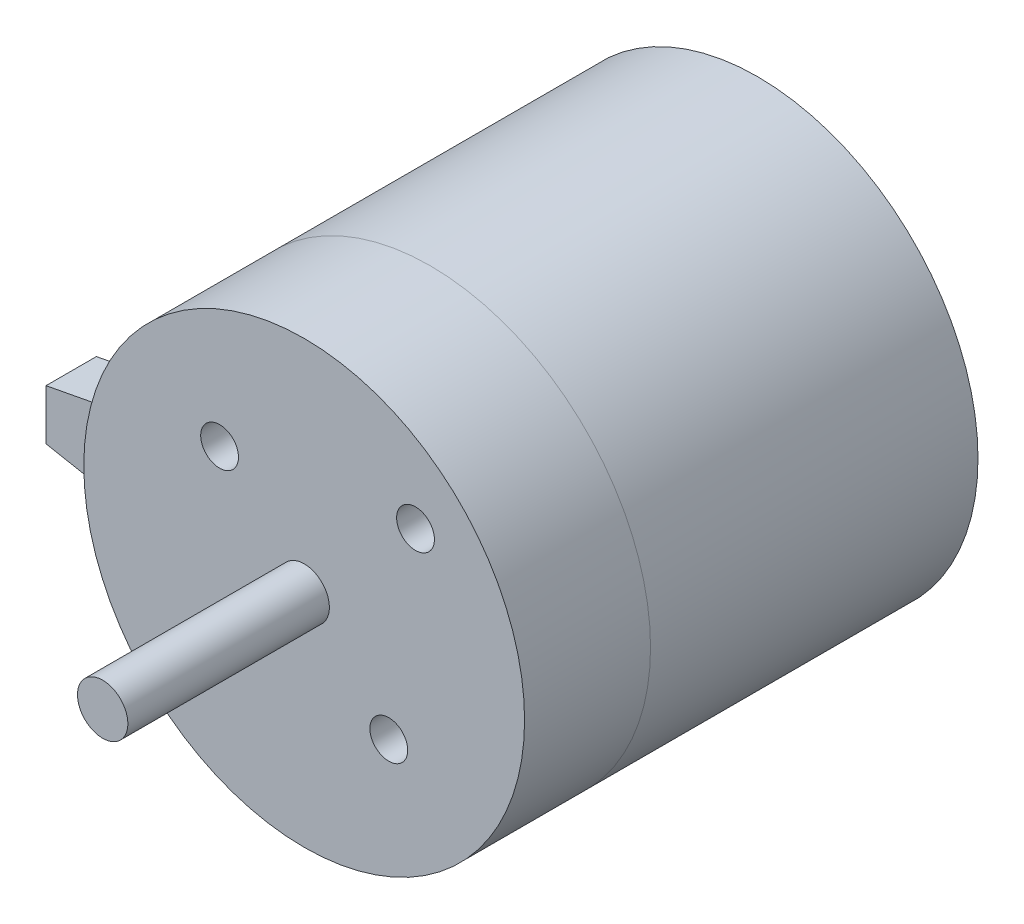
ISO-10303-21;
HEADER;
FILE_DESCRIPTION(('STEP AP214'),'2;1');
FILE_NAME('part.step','',(''),(''),'','','');
FILE_SCHEMA(('AUTOMOTIVE_DESIGN { 1 0 10303 214 1 1 1 1 }'));
ENDSEC;
DATA;
#1=APPLICATION_CONTEXT('core data for automotive mechanical design processes');
#2=APPLICATION_PROTOCOL_DEFINITION('international standard','automotive_design',2000,#1);
#3=PRODUCT_CONTEXT('',#1,'mechanical');
#4=PRODUCT('Part','Part','',(#3));
#5=PRODUCT_RELATED_PRODUCT_CATEGORY('part','',(#4));
#6=PRODUCT_DEFINITION_FORMATION('','',#4);
#7=PRODUCT_DEFINITION_CONTEXT('part definition',#1,'design');
#8=PRODUCT_DEFINITION('design','',#6,#7);
#9=PRODUCT_DEFINITION_SHAPE('','',#8);
#10=(LENGTH_UNIT() NAMED_UNIT(*) SI_UNIT(.MILLI.,.METRE.));
#11=(NAMED_UNIT(*) PLANE_ANGLE_UNIT() SI_UNIT($,.RADIAN.));
#12=(NAMED_UNIT(*) SI_UNIT($,.STERADIAN.) SOLID_ANGLE_UNIT());
#13=UNCERTAINTY_MEASURE_WITH_UNIT(LENGTH_MEASURE(1.E-05),#10,'distance_accuracy_value','');
#14=(GEOMETRIC_REPRESENTATION_CONTEXT(3) GLOBAL_UNCERTAINTY_ASSIGNED_CONTEXT((#13)) GLOBAL_UNIT_ASSIGNED_CONTEXT((#10,
#11,#12)) REPRESENTATION_CONTEXT('',''));
#15=CARTESIAN_POINT('',(0.,0.,0.));
#16=DIRECTION('',(0.,0.,1.));
#17=DIRECTION('',(1.,0.,0.));
#18=AXIS2_PLACEMENT_3D('',#15,#16,#17);
#19=CARTESIAN_POINT('',(0.,0.,36.));
#20=DIRECTION('',(0.,0.,-1.));
#21=DIRECTION('',(-1.,0.,0.));
#22=AXIS2_PLACEMENT_3D('',#19,#20,#21);
#23=CYLINDRICAL_SURFACE('',#22,17.5);
#24=CARTESIAN_POINT('',(0.,0.,30.));
#25=DIRECTION('',(0.,0.,1.));
#26=DIRECTION('',(1.,0.,0.));
#27=AXIS2_PLACEMENT_3D('',#24,#25,#26);
#28=CIRCLE('',#27,17.5);
#29=CARTESIAN_POINT('',(-17.2409396495667,3.,30.));
#30=VERTEX_POINT('',#29);
#31=CARTESIAN_POINT('',(-17.2409396495667,-3.,30.));
#32=VERTEX_POINT('',#31);
#33=EDGE_CURVE('E103',#30,#32,#28,.T.);
#34=ORIENTED_EDGE('',*,*,#33,.F.);
#35=DIRECTION('',(0.,0.,1.));
#36=VECTOR('',#35,1.);
#37=CARTESIAN_POINT('',(-17.2409396495667,3.,30.));
#38=LINE('',#37,#36);
#39=CARTESIAN_POINT('',(-17.2409396495667,3.,34.));
#40=VERTEX_POINT('',#39);
#41=EDGE_CURVE('E86',#30,#40,#38,.T.);
#42=ORIENTED_EDGE('',*,*,#41,.T.);
#43=CARTESIAN_POINT('',(0.,0.,34.));
#44=DIRECTION('',(0.,0.,1.));
#45=DIRECTION('',(1.,0.,0.));
#46=AXIS2_PLACEMENT_3D('',#43,#44,#45);
#47=CIRCLE('',#46,17.5);
#48=CARTESIAN_POINT('',(-17.2409396495667,-3.,34.));
#49=VERTEX_POINT('',#48);
#50=EDGE_CURVE('E109',#40,#49,#47,.T.);
#51=ORIENTED_EDGE('',*,*,#50,.T.);
#52=DIRECTION('',(0.,0.,1.));
#53=VECTOR('',#52,1.);
#54=CARTESIAN_POINT('',(-17.2409396495667,-3.,30.));
#55=LINE('',#54,#53);
#56=EDGE_CURVE('E56',#32,#49,#55,.T.);
#57=ORIENTED_EDGE('',*,*,#56,.F.);
#58=EDGE_LOOP('',(#34,#42,#51,#57));
#59=FACE_BOUND('',#58,.T.);
#60=CARTESIAN_POINT('',(0.,0.,36.));
#61=DIRECTION('',(0.,0.,1.));
#62=DIRECTION('',(1.,0.,0.));
#63=AXIS2_PLACEMENT_3D('',#60,#61,#62);
#64=CIRCLE('',#63,17.5);
#65=CARTESIAN_POINT('',(17.5,0.,36.));
#66=VERTEX_POINT('',#65);
#67=EDGE_CURVE('E171',#66,#66,#64,.T.);
#68=ORIENTED_EDGE('',*,*,#67,.F.);
#69=EDGE_LOOP('',(#68));
#70=FACE_BOUND('',#69,.T.);
#71=CARTESIAN_POINT('',(0.,0.,26.));
#72=DIRECTION('',(0.,0.,1.));
#73=DIRECTION('',(1.,0.,0.));
#74=AXIS2_PLACEMENT_3D('',#71,#72,#73);
#75=CIRCLE('',#74,17.5);
#76=CARTESIAN_POINT('',(17.5,0.,26.));
#77=VERTEX_POINT('',#76);
#78=EDGE_CURVE('E12',#77,#77,#75,.T.);
#79=ORIENTED_EDGE('',*,*,#78,.T.);
#80=EDGE_LOOP('',(#79));
#81=FACE_BOUND('',#80,.T.);
#82=ADVANCED_FACE('F41',(#59,#70,#81),#23,.T.);
#83=ORIENTED_EDGE('',*,*,#78,.F.);
#84=EDGE_LOOP('',(#83));
#85=FACE_BOUND('',#84,.T.);
#86=CARTESIAN_POINT('',(0.,0.,0.));
#87=DIRECTION('',(0.,0.,1.));
#88=DIRECTION('',(1.,0.,0.));
#89=AXIS2_PLACEMENT_3D('',#86,#87,#88);
#90=CIRCLE('',#89,17.5);
#91=CARTESIAN_POINT('',(17.5,0.,0.));
#92=VERTEX_POINT('',#91);
#93=EDGE_CURVE('E177',#92,#92,#90,.T.);
#94=ORIENTED_EDGE('',*,*,#93,.T.);
#95=EDGE_LOOP('',(#94));
#96=FACE_BOUND('',#95,.T.);
#97=ADVANCED_FACE('F43',(#85,#96),#23,.T.);
#98=CARTESIAN_POINT('',(0.,0.,36.));
#99=DIRECTION('',(0.,0.,1.));
#100=DIRECTION('',(1.,0.,0.));
#101=AXIS2_PLACEMENT_3D('',#98,#99,#100);
#102=PLANE('',#101);
#103=CARTESIAN_POINT('',(6.71751442127219,-6.71751442127221,36.));
#104=DIRECTION('',(0.,0.,1.));
#105=DIRECTION('',(1.,0.,0.));
#106=AXIS2_PLACEMENT_3D('',#103,#104,#105);
#107=CIRCLE('',#106,1.5);
#108=CARTESIAN_POINT('',(8.21751442127219,-6.71751442127221,36.));
#109=VERTEX_POINT('',#108);
#110=EDGE_CURVE('E117',#109,#109,#107,.T.);
#111=ORIENTED_EDGE('',*,*,#110,.F.);
#112=EDGE_LOOP('',(#111));
#113=FACE_BOUND('',#112,.T.);
#114=CARTESIAN_POINT('',(-8.83883476483183,-8.83883476483186,36.));
#115=DIRECTION('',(0.,0.,1.));
#116=DIRECTION('',(1.,0.,0.));
#117=AXIS2_PLACEMENT_3D('',#114,#115,#116);
#118=CIRCLE('',#117,1.5);
#119=CARTESIAN_POINT('',(-7.33883476483183,-8.83883476483186,36.));
#120=VERTEX_POINT('',#119);
#121=EDGE_CURVE('E130',#120,#120,#118,.T.);
#122=ORIENTED_EDGE('',*,*,#121,.F.);
#123=EDGE_LOOP('',(#122));
#124=FACE_BOUND('',#123,.T.);
#125=CARTESIAN_POINT('',(-6.71751442127219,6.71751442127221,36.));
#126=DIRECTION('',(0.,0.,1.));
#127=DIRECTION('',(1.,0.,0.));
#128=AXIS2_PLACEMENT_3D('',#125,#126,#127);
#129=CIRCLE('',#128,1.5);
#130=CARTESIAN_POINT('',(-5.21751442127219,6.71751442127221,36.));
#131=VERTEX_POINT('',#130);
#132=EDGE_CURVE('E124',#131,#131,#129,.T.);
#133=ORIENTED_EDGE('',*,*,#132,.F.);
#134=EDGE_LOOP('',(#133));
#135=FACE_BOUND('',#134,.T.);
#136=CARTESIAN_POINT('',(8.83883476483183,8.83883476483186,36.));
#137=DIRECTION('',(0.,0.,1.));
#138=DIRECTION('',(1.,0.,0.));
#139=AXIS2_PLACEMENT_3D('',#136,#137,#138);
#140=CIRCLE('',#139,1.5);
#141=CARTESIAN_POINT('',(10.3388347648318,8.83883476483186,36.));
#142=VERTEX_POINT('',#141);
#143=EDGE_CURVE('E123',#142,#142,#140,.T.);
#144=ORIENTED_EDGE('',*,*,#143,.F.);
#145=EDGE_LOOP('',(#144));
#146=FACE_BOUND('',#145,.T.);
#147=CARTESIAN_POINT('',(0.,0.,36.));
#148=DIRECTION('',(0.,0.,1.));
#149=DIRECTION('',(1.,0.,0.));
#150=AXIS2_PLACEMENT_3D('',#147,#148,#149);
#151=CIRCLE('',#150,2.);
#152=CARTESIAN_POINT('',(2.,0.,36.));
#153=VERTEX_POINT('',#152);
#154=EDGE_CURVE('E168',#153,#153,#151,.T.);
#155=ORIENTED_EDGE('',*,*,#154,.F.);
#156=EDGE_LOOP('',(#155));
#157=FACE_BOUND('',#156,.T.);
#158=ORIENTED_EDGE('',*,*,#67,.T.);
#159=EDGE_LOOP('',(#158));
#160=FACE_BOUND('',#159,.T.);
#161=ADVANCED_FACE('F188',(#113,#124,#135,#146,#157,#160),#102,.T.);
#162=CARTESIAN_POINT('',(0.,0.,0.));
#163=DIRECTION('',(0.,0.,1.));
#164=DIRECTION('',(1.,0.,0.));
#165=AXIS2_PLACEMENT_3D('',#162,#163,#164);
#166=PLANE('',#165);
#167=CARTESIAN_POINT('',(0.,7.5,0.));
#168=DIRECTION('',(0.,0.,1.));
#169=DIRECTION('',(1.,0.,0.));
#170=AXIS2_PLACEMENT_3D('',#167,#168,#169);
#171=CIRCLE('',#170,1.25);
#172=CARTESIAN_POINT('',(1.25,7.5,0.));
#173=VERTEX_POINT('',#172);
#174=EDGE_CURVE('E148',#173,#173,#171,.T.);
#175=ORIENTED_EDGE('',*,*,#174,.T.);
#176=EDGE_LOOP('',(#175));
#177=FACE_BOUND('',#176,.T.);
#178=CARTESIAN_POINT('',(6.49519052838329,-3.75,0.));
#179=DIRECTION('',(0.,0.,1.));
#180=DIRECTION('',(1.,0.,0.));
#181=AXIS2_PLACEMENT_3D('',#178,#179,#180);
#182=CIRCLE('',#181,1.25000000000004);
#183=CARTESIAN_POINT('',(7.74519052838333,-3.75,0.));
#184=VERTEX_POINT('',#183);
#185=EDGE_CURVE('E154',#184,#184,#182,.T.);
#186=ORIENTED_EDGE('',*,*,#185,.T.);
#187=EDGE_LOOP('',(#186));
#188=FACE_BOUND('',#187,.T.);
#189=CARTESIAN_POINT('',(-6.49519052838329,-3.75,0.));
#190=DIRECTION('',(0.,0.,1.));
#191=DIRECTION('',(1.,0.,0.));
#192=AXIS2_PLACEMENT_3D('',#189,#190,#191);
#193=CIRCLE('',#192,1.25000000000007);
#194=CARTESIAN_POINT('',(-5.24519052838322,-3.75,0.));
#195=VERTEX_POINT('',#194);
#196=EDGE_CURVE('E141',#195,#195,#193,.T.);
#197=ORIENTED_EDGE('',*,*,#196,.T.);
#198=EDGE_LOOP('',(#197));
#199=FACE_BOUND('',#198,.T.);
#200=CARTESIAN_POINT('',(0.,0.,0.));
#201=DIRECTION('',(0.,0.,1.));
#202=DIRECTION('',(1.,0.,0.));
#203=AXIS2_PLACEMENT_3D('',#200,#201,#202);
#204=CIRCLE('',#203,5.5);
#205=CARTESIAN_POINT('',(5.5,0.,0.));
#206=VERTEX_POINT('',#205);
#207=EDGE_CURVE('E147',#206,#206,#204,.T.);
#208=ORIENTED_EDGE('',*,*,#207,.T.);
#209=EDGE_LOOP('',(#208));
#210=FACE_BOUND('',#209,.T.);
#211=ORIENTED_EDGE('',*,*,#93,.F.);
#212=EDGE_LOOP('',(#211));
#213=FACE_BOUND('',#212,.T.);
#214=ADVANCED_FACE('F185',(#177,#188,#199,#210,#213),#166,.F.);
#215=CARTESIAN_POINT('',(0.,0.,52.));
#216=DIRECTION('',(0.,0.,-1.));
#217=DIRECTION('',(-1.,0.,0.));
#218=AXIS2_PLACEMENT_3D('',#215,#216,#217);
#219=CYLINDRICAL_SURFACE('',#218,2.);
#220=CARTESIAN_POINT('',(0.,0.,52.));
#221=DIRECTION('',(0.,0.,1.));
#222=DIRECTION('',(1.,0.,0.));
#223=AXIS2_PLACEMENT_3D('',#220,#221,#222);
#224=CIRCLE('',#223,2.);
#225=CARTESIAN_POINT('',(2.,0.,52.));
#226=VERTEX_POINT('',#225);
#227=EDGE_CURVE('E174',#226,#226,#224,.T.);
#228=ORIENTED_EDGE('',*,*,#227,.F.);
#229=EDGE_LOOP('',(#228));
#230=FACE_BOUND('',#229,.T.);
#231=ORIENTED_EDGE('',*,*,#154,.T.);
#232=EDGE_LOOP('',(#231));
#233=FACE_BOUND('',#232,.T.);
#234=ADVANCED_FACE('F187',(#230,#233),#219,.T.);
#235=CARTESIAN_POINT('',(0.,0.,52.));
#236=DIRECTION('',(0.,0.,1.));
#237=DIRECTION('',(1.,0.,0.));
#238=AXIS2_PLACEMENT_3D('',#235,#236,#237);
#239=PLANE('',#238);
#240=ORIENTED_EDGE('',*,*,#227,.T.);
#241=EDGE_LOOP('',(#240));
#242=FACE_BOUND('',#241,.T.);
#243=ADVANCED_FACE('F195',(#242),#239,.T.);
#244=CARTESIAN_POINT('',(0.,0.,-2.));
#245=DIRECTION('',(0.,0.,1.));
#246=DIRECTION('',(1.,0.,0.));
#247=AXIS2_PLACEMENT_3D('',#244,#245,#246);
#248=CYLINDRICAL_SURFACE('',#247,2.);
#249=CARTESIAN_POINT('',(0.,0.,-2.));
#250=DIRECTION('',(0.,0.,1.));
#251=DIRECTION('',(1.,0.,0.));
#252=AXIS2_PLACEMENT_3D('',#249,#250,#251);
#253=CIRCLE('',#252,2.);
#254=CARTESIAN_POINT('',(2.,0.,-2.));
#255=VERTEX_POINT('',#254);
#256=EDGE_CURVE('E162',#255,#255,#253,.T.);
#257=ORIENTED_EDGE('',*,*,#256,.F.);
#258=EDGE_LOOP('',(#257));
#259=FACE_BOUND('',#258,.T.);
#260=CARTESIAN_POINT('',(0.,0.,0.));
#261=DIRECTION('',(0.,0.,1.));
#262=DIRECTION('',(1.,0.,0.));
#263=AXIS2_PLACEMENT_3D('',#260,#261,#262);
#264=CIRCLE('',#263,2.);
#265=CARTESIAN_POINT('',(2.,0.,0.));
#266=VERTEX_POINT('',#265);
#267=EDGE_CURVE('E49',#266,#266,#264,.T.);
#268=ORIENTED_EDGE('',*,*,#267,.T.);
#269=EDGE_LOOP('',(#268));
#270=FACE_BOUND('',#269,.T.);
#271=ADVANCED_FACE('F291',(#259,#270),#248,.F.);
#272=CARTESIAN_POINT('',(0.,0.,-2.));
#273=DIRECTION('',(0.,0.,1.));
#274=DIRECTION('',(1.,0.,0.));
#275=AXIS2_PLACEMENT_3D('',#272,#273,#274);
#276=CYLINDRICAL_SURFACE('',#275,5.5);
#277=CARTESIAN_POINT('',(0.,0.,-2.));
#278=DIRECTION('',(0.,0.,1.));
#279=DIRECTION('',(1.,0.,0.));
#280=AXIS2_PLACEMENT_3D('',#277,#278,#279);
#281=CIRCLE('',#280,5.5);
#282=CARTESIAN_POINT('',(5.5,0.,-2.));
#283=VERTEX_POINT('',#282);
#284=EDGE_CURVE('E165',#283,#283,#281,.T.);
#285=ORIENTED_EDGE('',*,*,#284,.T.);
#286=EDGE_LOOP('',(#285));
#287=FACE_BOUND('',#286,.T.);
#288=ORIENTED_EDGE('',*,*,#207,.F.);
#289=EDGE_LOOP('',(#288));
#290=FACE_BOUND('',#289,.T.);
#291=ADVANCED_FACE('F287',(#287,#290),#276,.T.);
#292=CARTESIAN_POINT('',(0.,0.,-2.));
#293=DIRECTION('',(0.,0.,1.));
#294=DIRECTION('',(1.,0.,0.));
#295=AXIS2_PLACEMENT_3D('',#292,#293,#294);
#296=PLANE('',#295);
#297=ORIENTED_EDGE('',*,*,#256,.T.);
#298=EDGE_LOOP('',(#297));
#299=FACE_BOUND('',#298,.T.);
#300=ORIENTED_EDGE('',*,*,#284,.F.);
#301=EDGE_LOOP('',(#300));
#302=FACE_BOUND('',#301,.T.);
#303=ADVANCED_FACE('F203',(#299,#302),#296,.F.);
#304=ORIENTED_EDGE('',*,*,#267,.F.);
#305=EDGE_LOOP('',(#304));
#306=FACE_BOUND('',#305,.T.);
#307=ADVANCED_FACE('F190',(#306),#166,.F.);
#308=CARTESIAN_POINT('',(-6.49519052838329,-3.75,3.5));
#309=DIRECTION('',(0.,0.,-1.));
#310=DIRECTION('',(-1.,0.,0.));
#311=AXIS2_PLACEMENT_3D('',#308,#309,#310);
#312=CYLINDRICAL_SURFACE('',#311,1.25000000000007);
#313=CARTESIAN_POINT('',(-6.49519052838329,-3.75,3.5));
#314=DIRECTION('',(0.,0.,1.));
#315=DIRECTION('',(1.,0.,0.));
#316=AXIS2_PLACEMENT_3D('',#313,#314,#315);
#317=CIRCLE('',#316,1.25000000000007);
#318=CARTESIAN_POINT('',(-5.24519052838322,-3.75,3.5));
#319=VERTEX_POINT('',#318);
#320=EDGE_CURVE('E157',#319,#319,#317,.T.);
#321=ORIENTED_EDGE('',*,*,#320,.T.);
#322=EDGE_LOOP('',(#321));
#323=FACE_BOUND('',#322,.T.);
#324=ORIENTED_EDGE('',*,*,#196,.F.);
#325=EDGE_LOOP('',(#324));
#326=FACE_BOUND('',#325,.T.);
#327=ADVANCED_FACE('F202',(#323,#326),#312,.F.);
#328=CARTESIAN_POINT('',(0.,0.,3.5));
#329=DIRECTION('',(0.,0.,1.));
#330=DIRECTION('',(1.,0.,0.));
#331=AXIS2_PLACEMENT_3D('',#328,#329,#330);
#332=PLANE('',#331);
#333=ORIENTED_EDGE('',*,*,#320,.F.);
#334=EDGE_LOOP('',(#333));
#335=FACE_BOUND('',#334,.T.);
#336=ADVANCED_FACE('F277',(#335),#332,.F.);
#337=CARTESIAN_POINT('',(6.49519052838329,-3.75,3.5));
#338=DIRECTION('',(0.,0.,-1.));
#339=DIRECTION('',(-1.,0.,0.));
#340=AXIS2_PLACEMENT_3D('',#337,#338,#339);
#341=CYLINDRICAL_SURFACE('',#340,1.25000000000004);
#342=CARTESIAN_POINT('',(6.49519052838329,-3.75,3.5));
#343=DIRECTION('',(0.,0.,1.));
#344=DIRECTION('',(1.,0.,0.));
#345=AXIS2_PLACEMENT_3D('',#342,#343,#344);
#346=CIRCLE('',#345,1.25000000000004);
#347=CARTESIAN_POINT('',(7.74519052838333,-3.75,3.5));
#348=VERTEX_POINT('',#347);
#349=EDGE_CURVE('E151',#348,#348,#346,.T.);
#350=ORIENTED_EDGE('',*,*,#349,.T.);
#351=EDGE_LOOP('',(#350));
#352=FACE_BOUND('',#351,.T.);
#353=ORIENTED_EDGE('',*,*,#185,.F.);
#354=EDGE_LOOP('',(#353));
#355=FACE_BOUND('',#354,.T.);
#356=ADVANCED_FACE('F273',(#352,#355),#341,.F.);
#357=CARTESIAN_POINT('',(0.,0.,3.5));
#358=DIRECTION('',(0.,0.,1.));
#359=DIRECTION('',(1.,0.,0.));
#360=AXIS2_PLACEMENT_3D('',#357,#358,#359);
#361=PLANE('',#360);
#362=ORIENTED_EDGE('',*,*,#349,.F.);
#363=EDGE_LOOP('',(#362));
#364=FACE_BOUND('',#363,.T.);
#365=ADVANCED_FACE('F269',(#364),#361,.F.);
#366=CARTESIAN_POINT('',(0.,7.5,3.5));
#367=DIRECTION('',(0.,0.,-1.));
#368=DIRECTION('',(-1.,0.,0.));
#369=AXIS2_PLACEMENT_3D('',#366,#367,#368);
#370=CYLINDRICAL_SURFACE('',#369,1.25);
#371=CARTESIAN_POINT('',(0.,7.5,3.5));
#372=DIRECTION('',(0.,0.,1.));
#373=DIRECTION('',(1.,0.,0.));
#374=AXIS2_PLACEMENT_3D('',#371,#372,#373);
#375=CIRCLE('',#374,1.25);
#376=CARTESIAN_POINT('',(1.25,7.5,3.5));
#377=VERTEX_POINT('',#376);
#378=EDGE_CURVE('E144',#377,#377,#375,.T.);
#379=ORIENTED_EDGE('',*,*,#378,.T.);
#380=EDGE_LOOP('',(#379));
#381=FACE_BOUND('',#380,.T.);
#382=ORIENTED_EDGE('',*,*,#174,.F.);
#383=EDGE_LOOP('',(#382));
#384=FACE_BOUND('',#383,.T.);
#385=ADVANCED_FACE('F265',(#381,#384),#370,.F.);
#386=CARTESIAN_POINT('',(0.,0.,3.5));
#387=DIRECTION('',(0.,0.,1.));
#388=DIRECTION('',(1.,0.,0.));
#389=AXIS2_PLACEMENT_3D('',#386,#387,#388);
#390=PLANE('',#389);
#391=ORIENTED_EDGE('',*,*,#378,.F.);
#392=EDGE_LOOP('',(#391));
#393=FACE_BOUND('',#392,.T.);
#394=ADVANCED_FACE('F261',(#393),#390,.F.);
#395=CARTESIAN_POINT('',(8.83883476483183,8.83883476483186,33.));
#396=DIRECTION('',(0.,0.,1.));
#397=DIRECTION('',(1.,0.,0.));
#398=AXIS2_PLACEMENT_3D('',#395,#396,#397);
#399=CYLINDRICAL_SURFACE('',#398,1.5);
#400=CARTESIAN_POINT('',(8.83883476483183,8.83883476483186,33.));
#401=DIRECTION('',(0.,0.,1.));
#402=DIRECTION('',(1.,0.,0.));
#403=AXIS2_PLACEMENT_3D('',#400,#401,#402);
#404=CIRCLE('',#403,1.5);
#405=CARTESIAN_POINT('',(10.3388347648318,8.83883476483186,33.));
#406=VERTEX_POINT('',#405);
#407=EDGE_CURVE('E138',#406,#406,#404,.T.);
#408=ORIENTED_EDGE('',*,*,#407,.F.);
#409=EDGE_LOOP('',(#408));
#410=FACE_BOUND('',#409,.T.);
#411=ORIENTED_EDGE('',*,*,#143,.T.);
#412=EDGE_LOOP('',(#411));
#413=FACE_BOUND('',#412,.T.);
#414=ADVANCED_FACE('F257',(#410,#413),#399,.F.);
#415=CARTESIAN_POINT('',(8.83883476483183,8.83883476483186,33.));
#416=DIRECTION('',(0.,0.,1.));
#417=DIRECTION('',(1.,0.,0.));
#418=AXIS2_PLACEMENT_3D('',#415,#416,#417);
#419=PLANE('',#418);
#420=ORIENTED_EDGE('',*,*,#407,.T.);
#421=EDGE_LOOP('',(#420));
#422=FACE_BOUND('',#421,.T.);
#423=ADVANCED_FACE('F243',(#422),#419,.T.);
#424=CARTESIAN_POINT('',(-6.71751442127219,6.71751442127221,33.));
#425=DIRECTION('',(0.,0.,1.));
#426=DIRECTION('',(1.,0.,0.));
#427=AXIS2_PLACEMENT_3D('',#424,#425,#426);
#428=CYLINDRICAL_SURFACE('',#427,1.5);
#429=CARTESIAN_POINT('',(-6.71751442127219,6.71751442127221,33.));
#430=DIRECTION('',(0.,0.,1.));
#431=DIRECTION('',(1.,0.,0.));
#432=AXIS2_PLACEMENT_3D('',#429,#430,#431);
#433=CIRCLE('',#432,1.5);
#434=CARTESIAN_POINT('',(-5.21751442127219,6.71751442127221,33.));
#435=VERTEX_POINT('',#434);
#436=EDGE_CURVE('E120',#435,#435,#433,.T.);
#437=ORIENTED_EDGE('',*,*,#436,.F.);
#438=EDGE_LOOP('',(#437));
#439=FACE_BOUND('',#438,.T.);
#440=ORIENTED_EDGE('',*,*,#132,.T.);
#441=EDGE_LOOP('',(#440));
#442=FACE_BOUND('',#441,.T.);
#443=ADVANCED_FACE('F239',(#439,#442),#428,.F.);
#444=CARTESIAN_POINT('',(-6.71751442127219,6.71751442127221,33.));
#445=DIRECTION('',(0.,0.,1.));
#446=DIRECTION('',(1.,0.,0.));
#447=AXIS2_PLACEMENT_3D('',#444,#445,#446);
#448=PLANE('',#447);
#449=ORIENTED_EDGE('',*,*,#436,.T.);
#450=EDGE_LOOP('',(#449));
#451=FACE_BOUND('',#450,.T.);
#452=ADVANCED_FACE('F235',(#451),#448,.T.);
#453=CARTESIAN_POINT('',(-8.83883476483183,-8.83883476483186,33.));
#454=DIRECTION('',(0.,0.,1.));
#455=DIRECTION('',(1.,0.,0.));
#456=AXIS2_PLACEMENT_3D('',#453,#454,#455);
#457=CYLINDRICAL_SURFACE('',#456,1.5);
#458=CARTESIAN_POINT('',(-8.83883476483183,-8.83883476483186,33.));
#459=DIRECTION('',(0.,0.,1.));
#460=DIRECTION('',(1.,0.,0.));
#461=AXIS2_PLACEMENT_3D('',#458,#459,#460);
#462=CIRCLE('',#461,1.5);
#463=CARTESIAN_POINT('',(-7.33883476483183,-8.83883476483186,33.));
#464=VERTEX_POINT('',#463);
#465=EDGE_CURVE('E127',#464,#464,#462,.T.);
#466=ORIENTED_EDGE('',*,*,#465,.F.);
#467=EDGE_LOOP('',(#466));
#468=FACE_BOUND('',#467,.T.);
#469=ORIENTED_EDGE('',*,*,#121,.T.);
#470=EDGE_LOOP('',(#469));
#471=FACE_BOUND('',#470,.T.);
#472=ADVANCED_FACE('F238',(#468,#471),#457,.F.);
#473=CARTESIAN_POINT('',(-8.83883476483183,-8.83883476483186,33.));
#474=DIRECTION('',(0.,0.,1.));
#475=DIRECTION('',(1.,0.,0.));
#476=AXIS2_PLACEMENT_3D('',#473,#474,#475);
#477=PLANE('',#476);
#478=ORIENTED_EDGE('',*,*,#465,.T.);
#479=EDGE_LOOP('',(#478));
#480=FACE_BOUND('',#479,.T.);
#481=ADVANCED_FACE('F245',(#480),#477,.T.);
#482=CARTESIAN_POINT('',(6.71751442127219,-6.71751442127221,33.));
#483=DIRECTION('',(0.,0.,1.));
#484=DIRECTION('',(1.,0.,0.));
#485=AXIS2_PLACEMENT_3D('',#482,#483,#484);
#486=CYLINDRICAL_SURFACE('',#485,1.5);
#487=CARTESIAN_POINT('',(6.71751442127219,-6.71751442127221,33.));
#488=DIRECTION('',(0.,0.,1.));
#489=DIRECTION('',(1.,0.,0.));
#490=AXIS2_PLACEMENT_3D('',#487,#488,#489);
#491=CIRCLE('',#490,1.5);
#492=CARTESIAN_POINT('',(8.21751442127219,-6.71751442127221,33.));
#493=VERTEX_POINT('',#492);
#494=EDGE_CURVE('E133',#493,#493,#491,.T.);
#495=ORIENTED_EDGE('',*,*,#494,.F.);
#496=EDGE_LOOP('',(#495));
#497=FACE_BOUND('',#496,.T.);
#498=ORIENTED_EDGE('',*,*,#110,.T.);
#499=EDGE_LOOP('',(#498));
#500=FACE_BOUND('',#499,.T.);
#501=ADVANCED_FACE('F227',(#497,#500),#486,.F.);
#502=CARTESIAN_POINT('',(6.71751442127219,-6.71751442127221,33.));
#503=DIRECTION('',(0.,0.,1.));
#504=DIRECTION('',(1.,0.,0.));
#505=AXIS2_PLACEMENT_3D('',#502,#503,#504);
#506=PLANE('',#505);
#507=ORIENTED_EDGE('',*,*,#494,.T.);
#508=EDGE_LOOP('',(#507));
#509=FACE_BOUND('',#508,.T.);
#510=ADVANCED_FACE('F220',(#509),#506,.T.);
#511=CARTESIAN_POINT('',(-1.15215465763002,-6.05925087750913,30.));
#512=DIRECTION('',(0.186801007615505,0.982397772571697,0.));
#513=DIRECTION('',(-0.982397772571697,0.186801007615505,0.));
#514=AXIS2_PLACEMENT_3D('',#511,#512,#513);
#515=PLANE('',#514);
#516=DIRECTION('',(-0.982397772571697,0.186801007615505,0.));
#517=VECTOR('',#516,1.);
#518=CARTESIAN_POINT('',(-1.15215465763002,-6.05925087750913,34.));
#519=LINE('',#518,#517);
#520=CARTESIAN_POINT('',(-22.5,-2.,34.));
#521=VERTEX_POINT('',#520);
#522=EDGE_CURVE('E105',#49,#521,#519,.T.);
#523=ORIENTED_EDGE('',*,*,#522,.T.);
#524=DIRECTION('',(0.,0.,1.));
#525=VECTOR('',#524,1.);
#526=CARTESIAN_POINT('',(-22.5,-2.,30.));
#527=LINE('',#526,#525);
#528=CARTESIAN_POINT('',(-22.5,-2.,30.));
#529=VERTEX_POINT('',#528);
#530=EDGE_CURVE('E79',#529,#521,#527,.T.);
#531=ORIENTED_EDGE('',*,*,#530,.F.);
#532=DIRECTION('',(-0.982397772571697,0.186801007615505,0.));
#533=VECTOR('',#532,1.);
#534=CARTESIAN_POINT('',(-1.15215465763002,-6.05925087750913,30.));
#535=LINE('',#534,#533);
#536=EDGE_CURVE('E62',#32,#529,#535,.T.);
#537=ORIENTED_EDGE('',*,*,#536,.F.);
#538=ORIENTED_EDGE('',*,*,#56,.T.);
#539=EDGE_LOOP('',(#523,#531,#537,#538));
#540=FACE_BOUND('',#539,.T.);
#541=ADVANCED_FACE('F218',(#540),#515,.F.);
#542=CARTESIAN_POINT('',(-22.5,0.,30.));
#543=DIRECTION('',(-1.,0.,0.));
#544=DIRECTION('',(0.,0.,1.));
#545=AXIS2_PLACEMENT_3D('',#542,#543,#544);
#546=PLANE('',#545);
#547=DIRECTION('',(0.,-1.,0.));
#548=VECTOR('',#547,1.);
#549=CARTESIAN_POINT('',(-22.5,0.,34.));
#550=LINE('',#549,#548);
#551=CARTESIAN_POINT('',(-22.5,2.,34.));
#552=VERTEX_POINT('',#551);
#553=EDGE_CURVE('E94',#552,#521,#550,.T.);
#554=ORIENTED_EDGE('',*,*,#553,.F.);
#555=DIRECTION('',(0.,0.,1.));
#556=VECTOR('',#555,1.);
#557=CARTESIAN_POINT('',(-22.5,2.,30.));
#558=LINE('',#557,#556);
#559=CARTESIAN_POINT('',(-22.5,2.,30.));
#560=VERTEX_POINT('',#559);
#561=EDGE_CURVE('E89',#560,#552,#558,.T.);
#562=ORIENTED_EDGE('',*,*,#561,.F.);
#563=DIRECTION('',(0.,-1.,0.));
#564=VECTOR('',#563,1.);
#565=CARTESIAN_POINT('',(-22.5,0.,30.));
#566=LINE('',#565,#564);
#567=EDGE_CURVE('E92',#560,#529,#566,.T.);
#568=ORIENTED_EDGE('',*,*,#567,.T.);
#569=ORIENTED_EDGE('',*,*,#530,.T.);
#570=EDGE_LOOP('',(#554,#562,#568,#569));
#571=FACE_BOUND('',#570,.T.);
#572=ADVANCED_FACE('F91',(#571),#546,.T.);
#573=CARTESIAN_POINT('',(-1.15215465763002,6.05925087750913,30.));
#574=DIRECTION('',(-0.186801007615505,0.982397772571697,0.));
#575=DIRECTION('',(-0.982397772571697,-0.186801007615505,0.));
#576=AXIS2_PLACEMENT_3D('',#573,#574,#575);
#577=PLANE('',#576);
#578=DIRECTION('',(-0.982397772571697,-0.186801007615505,0.));
#579=VECTOR('',#578,1.);
#580=CARTESIAN_POINT('',(-1.15215465763002,6.05925087750913,34.));
#581=LINE('',#580,#579);
#582=EDGE_CURVE('E112',#40,#552,#581,.T.);
#583=ORIENTED_EDGE('',*,*,#582,.F.);
#584=ORIENTED_EDGE('',*,*,#41,.F.);
#585=DIRECTION('',(-0.982397772571697,-0.186801007615505,0.));
#586=VECTOR('',#585,1.);
#587=CARTESIAN_POINT('',(-1.15215465763002,6.05925087750913,30.));
#588=LINE('',#587,#586);
#589=EDGE_CURVE('E99',#30,#560,#588,.T.);
#590=ORIENTED_EDGE('',*,*,#589,.T.);
#591=ORIENTED_EDGE('',*,*,#561,.T.);
#592=EDGE_LOOP('',(#583,#584,#590,#591));
#593=FACE_BOUND('',#592,.T.);
#594=ADVANCED_FACE('F102',(#593),#577,.T.);
#595=CARTESIAN_POINT('',(0.,0.,30.));
#596=DIRECTION('',(0.,0.,1.));
#597=DIRECTION('',(1.,0.,0.));
#598=AXIS2_PLACEMENT_3D('',#595,#596,#597);
#599=PLANE('',#598);
#600=ORIENTED_EDGE('',*,*,#33,.T.);
#601=ORIENTED_EDGE('',*,*,#536,.T.);
#602=ORIENTED_EDGE('',*,*,#567,.F.);
#603=ORIENTED_EDGE('',*,*,#589,.F.);
#604=EDGE_LOOP('',(#600,#601,#602,#603));
#605=FACE_BOUND('',#604,.T.);
#606=ADVANCED_FACE('F98',(#605),#599,.F.);
#607=CARTESIAN_POINT('',(0.,0.,34.));
#608=DIRECTION('',(0.,0.,1.));
#609=DIRECTION('',(1.,0.,0.));
#610=AXIS2_PLACEMENT_3D('',#607,#608,#609);
#611=PLANE('',#610);
#612=ORIENTED_EDGE('',*,*,#50,.F.);
#613=ORIENTED_EDGE('',*,*,#582,.T.);
#614=ORIENTED_EDGE('',*,*,#553,.T.);
#615=ORIENTED_EDGE('',*,*,#522,.F.);
#616=EDGE_LOOP('',(#612,#613,#614,#615));
#617=FACE_BOUND('',#616,.T.);
#618=ADVANCED_FACE('F217',(#617),#611,.T.);
#619=CLOSED_SHELL('',(#82,#97,#161,#214,#234,#243,#271,#291,#303,#307,#327,#336,#356,#365,#385,
#394,#414,#423,#443,#452,#472,#481,#501,#510,#541,#572,#594,#606,#618));
#620=MANIFOLD_SOLID_BREP('B2',#619);
#621=ADVANCED_BREP_SHAPE_REPRESENTATION('',(#18,#620),#14);
#622=SHAPE_DEFINITION_REPRESENTATION(#9,#621);
ENDSEC;
END-ISO-10303-21;
